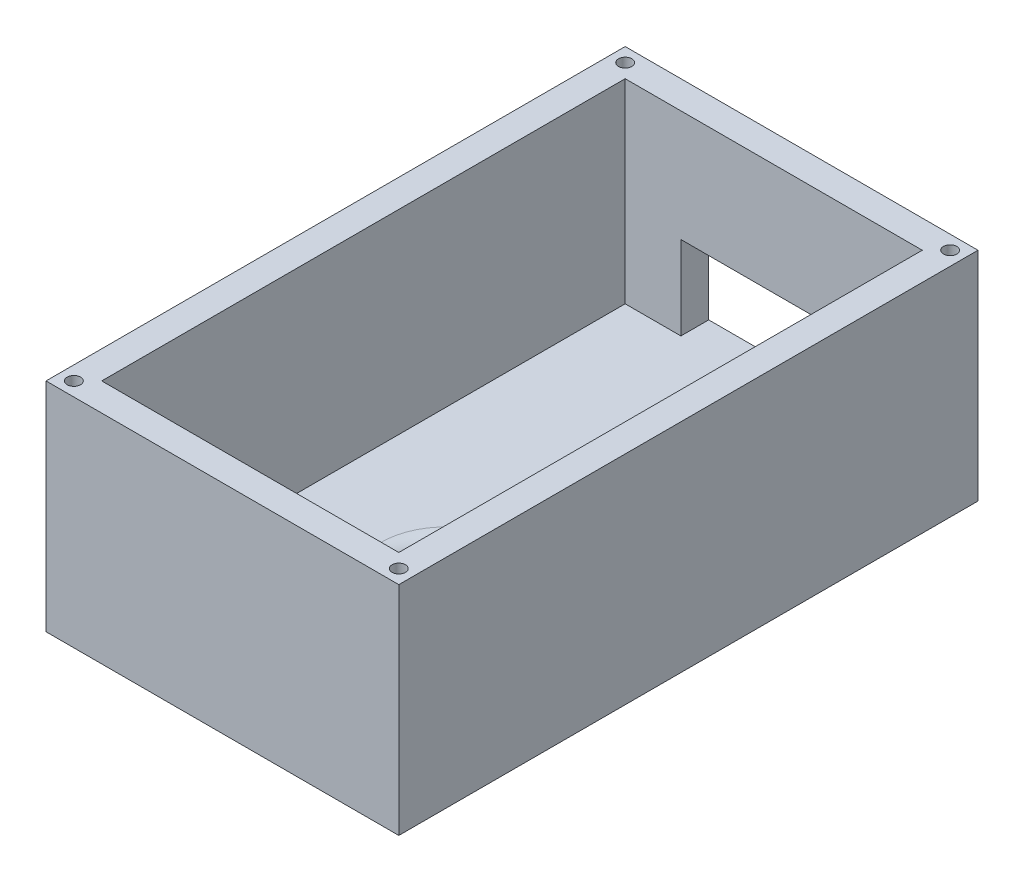
ISO-10303-21;
HEADER;
FILE_DESCRIPTION(('STEP AP214'),'2;1');
FILE_NAME('part.step','',(''),(''),'','','');
FILE_SCHEMA(('AUTOMOTIVE_DESIGN { 1 0 10303 214 1 1 1 1 }'));
ENDSEC;
DATA;
#1=APPLICATION_CONTEXT('core data for automotive mechanical design processes');
#2=APPLICATION_PROTOCOL_DEFINITION('international standard','automotive_design',2000,#1);
#3=PRODUCT_CONTEXT('',#1,'mechanical');
#4=PRODUCT('Part','Part','',(#3));
#5=PRODUCT_RELATED_PRODUCT_CATEGORY('part','',(#4));
#6=PRODUCT_DEFINITION_FORMATION('','',#4);
#7=PRODUCT_DEFINITION_CONTEXT('part definition',#1,'design');
#8=PRODUCT_DEFINITION('design','',#6,#7);
#9=PRODUCT_DEFINITION_SHAPE('','',#8);
#10=(LENGTH_UNIT() NAMED_UNIT(*) SI_UNIT(.MILLI.,.METRE.));
#11=(NAMED_UNIT(*) PLANE_ANGLE_UNIT() SI_UNIT($,.RADIAN.));
#12=(NAMED_UNIT(*) SI_UNIT($,.STERADIAN.) SOLID_ANGLE_UNIT());
#13=UNCERTAINTY_MEASURE_WITH_UNIT(LENGTH_MEASURE(1.E-05),#10,'distance_accuracy_value','');
#14=(GEOMETRIC_REPRESENTATION_CONTEXT(3) GLOBAL_UNCERTAINTY_ASSIGNED_CONTEXT((#13)) GLOBAL_UNIT_ASSIGNED_CONTEXT((#10,
#11,#12)) REPRESENTATION_CONTEXT('',''));
#15=CARTESIAN_POINT('',(0.,0.,0.));
#16=DIRECTION('',(0.,0.,1.));
#17=DIRECTION('',(1.,0.,0.));
#18=AXIS2_PLACEMENT_3D('',#15,#16,#17);
#19=CARTESIAN_POINT('',(2.49053892215568,4.,-3.42449101796407));
#20=DIRECTION('',(1.,0.,0.));
#21=DIRECTION('',(0.,0.,-1.));
#22=AXIS2_PLACEMENT_3D('',#19,#20,#21);
#23=PLANE('',#22);
#24=DIRECTION('',(0.,0.,1.));
#25=VECTOR('',#24,1.);
#26=CARTESIAN_POINT('',(2.49053892215568,0.,-3.42449101796407));
#27=LINE('',#26,#25);
#28=CARTESIAN_POINT('',(2.49053892215568,0.,-107.404491017964));
#29=VERTEX_POINT('',#28);
#30=CARTESIAN_POINT('',(2.49053892215568,0.,-3.42449101796407));
#31=VERTEX_POINT('',#30);
#32=EDGE_CURVE('E359',#29,#31,#27,.T.);
#33=ORIENTED_EDGE('',*,*,#32,.T.);
#34=DIRECTION('',(0.,-1.,0.));
#35=VECTOR('',#34,1.);
#36=CARTESIAN_POINT('',(2.49053892215568,4.,-3.42449101796407));
#37=LINE('',#36,#35);
#38=CARTESIAN_POINT('',(2.49053892215568,39.,-3.42449101796407));
#39=VERTEX_POINT('',#38);
#40=EDGE_CURVE('E384',#39,#31,#37,.T.);
#41=ORIENTED_EDGE('',*,*,#40,.F.);
#42=DIRECTION('',(0.,0.,1.));
#43=VECTOR('',#42,1.);
#44=CARTESIAN_POINT('',(2.49053892215568,39.,-107.404491017964));
#45=LINE('',#44,#43);
#46=CARTESIAN_POINT('',(2.49053892215568,39.,-107.404491017964));
#47=VERTEX_POINT('',#46);
#48=EDGE_CURVE('E343',#47,#39,#45,.T.);
#49=ORIENTED_EDGE('',*,*,#48,.F.);
#50=DIRECTION('',(0.,-1.,0.));
#51=VECTOR('',#50,1.);
#52=CARTESIAN_POINT('',(2.49053892215568,4.,-107.404491017964));
#53=LINE('',#52,#51);
#54=EDGE_CURVE('E372',#47,#29,#53,.T.);
#55=ORIENTED_EDGE('',*,*,#54,.T.);
#56=EDGE_LOOP('',(#33,#41,#49,#55));
#57=FACE_BOUND('',#56,.T.);
#58=ADVANCED_FACE('F38',(#57),#23,.F.);
#59=CARTESIAN_POINT('',(2.49053892215568,4.,-3.42449101796407));
#60=DIRECTION('',(0.,0.,-1.));
#61=DIRECTION('',(-1.,0.,0.));
#62=AXIS2_PLACEMENT_3D('',#59,#60,#61);
#63=PLANE('',#62);
#64=DIRECTION('',(1.,0.,0.));
#65=VECTOR('',#64,1.);
#66=CARTESIAN_POINT('',(2.49053892215568,0.,-3.42449101796407));
#67=LINE('',#66,#65);
#68=CARTESIAN_POINT('',(65.8305389221557,0.,-3.42449101796407));
#69=VERTEX_POINT('',#68);
#70=EDGE_CURVE('E363',#31,#69,#67,.T.);
#71=ORIENTED_EDGE('',*,*,#70,.T.);
#72=DIRECTION('',(0.,-1.,0.));
#73=VECTOR('',#72,1.);
#74=CARTESIAN_POINT('',(65.8305389221557,4.,-3.42449101796407));
#75=LINE('',#74,#73);
#76=CARTESIAN_POINT('',(65.8305389221557,39.,-3.42449101796407));
#77=VERTEX_POINT('',#76);
#78=EDGE_CURVE('E380',#77,#69,#75,.T.);
#79=ORIENTED_EDGE('',*,*,#78,.F.);
#80=DIRECTION('',(1.,0.,0.));
#81=VECTOR('',#80,1.);
#82=CARTESIAN_POINT('',(2.49053892215568,39.,-3.42449101796407));
#83=LINE('',#82,#81);
#84=EDGE_CURVE('E347',#39,#77,#83,.T.);
#85=ORIENTED_EDGE('',*,*,#84,.F.);
#86=ORIENTED_EDGE('',*,*,#40,.T.);
#87=EDGE_LOOP('',(#71,#79,#85,#86));
#88=FACE_BOUND('',#87,.T.);
#89=ADVANCED_FACE('F452',(#88),#63,.F.);
#90=CARTESIAN_POINT('',(65.8305389221557,4.,-3.42449101796407));
#91=DIRECTION('',(-1.,0.,0.));
#92=DIRECTION('',(0.,0.,1.));
#93=AXIS2_PLACEMENT_3D('',#90,#91,#92);
#94=PLANE('',#93);
#95=DIRECTION('',(0.,0.,-1.));
#96=VECTOR('',#95,1.);
#97=CARTESIAN_POINT('',(65.8305389221557,0.,-3.42449101796407));
#98=LINE('',#97,#96);
#99=CARTESIAN_POINT('',(65.8305389221557,0.,-107.404491017964));
#100=VERTEX_POINT('',#99);
#101=EDGE_CURVE('E366',#69,#100,#98,.T.);
#102=ORIENTED_EDGE('',*,*,#101,.T.);
#103=DIRECTION('',(0.,-1.,0.));
#104=VECTOR('',#103,1.);
#105=CARTESIAN_POINT('',(65.8305389221557,4.,-107.404491017964));
#106=LINE('',#105,#104);
#107=CARTESIAN_POINT('',(65.8305389221557,39.,-107.404491017964));
#108=VERTEX_POINT('',#107);
#109=EDGE_CURVE('E376',#108,#100,#106,.T.);
#110=ORIENTED_EDGE('',*,*,#109,.F.);
#111=DIRECTION('',(0.,0.,-1.));
#112=VECTOR('',#111,1.);
#113=CARTESIAN_POINT('',(65.8305389221557,39.,-107.404491017964));
#114=LINE('',#113,#112);
#115=EDGE_CURVE('E351',#77,#108,#114,.T.);
#116=ORIENTED_EDGE('',*,*,#115,.F.);
#117=ORIENTED_EDGE('',*,*,#78,.T.);
#118=EDGE_LOOP('',(#102,#110,#116,#117));
#119=FACE_BOUND('',#118,.T.);
#120=ADVANCED_FACE('F458',(#119),#94,.F.);
#121=CARTESIAN_POINT('',(2.49053892215568,4.,-107.404491017964));
#122=DIRECTION('',(0.,0.,1.));
#123=DIRECTION('',(1.,0.,0.));
#124=AXIS2_PLACEMENT_3D('',#121,#122,#123);
#125=PLANE('',#124);
#126=DIRECTION('',(-1.,0.,0.));
#127=VECTOR('',#126,1.);
#128=CARTESIAN_POINT('',(17.4905389221557,19.,-107.404491017964));
#129=LINE('',#128,#127);
#130=CARTESIAN_POINT('',(50.8305389221557,19.,-107.404491017964));
#131=VERTEX_POINT('',#130);
#132=CARTESIAN_POINT('',(17.4905389221557,19.,-107.404491017964));
#133=VERTEX_POINT('',#132);
#134=EDGE_CURVE('E242',#131,#133,#129,.T.);
#135=ORIENTED_EDGE('',*,*,#134,.T.);
#136=DIRECTION('',(0.,-1.,0.));
#137=VECTOR('',#136,1.);
#138=CARTESIAN_POINT('',(17.4905389221557,4.,-107.404491017964));
#139=LINE('',#138,#137);
#140=CARTESIAN_POINT('',(17.4905389221557,4.,-107.404491017964));
#141=VERTEX_POINT('',#140);
#142=EDGE_CURVE('E229',#133,#141,#139,.T.);
#143=ORIENTED_EDGE('',*,*,#142,.T.);
#144=DIRECTION('',(1.,0.,0.));
#145=VECTOR('',#144,1.);
#146=CARTESIAN_POINT('',(17.4905389221557,4.,-107.404491017964));
#147=LINE('',#146,#145);
#148=CARTESIAN_POINT('',(50.8305389221557,4.,-107.404491017964));
#149=VERTEX_POINT('',#148);
#150=EDGE_CURVE('E233',#141,#149,#147,.T.);
#151=ORIENTED_EDGE('',*,*,#150,.T.);
#152=DIRECTION('',(0.,1.,0.));
#153=VECTOR('',#152,1.);
#154=CARTESIAN_POINT('',(50.8305389221557,4.,-107.404491017964));
#155=LINE('',#154,#153);
#156=EDGE_CURVE('E238',#149,#131,#155,.T.);
#157=ORIENTED_EDGE('',*,*,#156,.T.);
#158=EDGE_LOOP('',(#135,#143,#151,#157));
#159=FACE_BOUND('',#158,.T.);
#160=DIRECTION('',(-1.,0.,0.));
#161=VECTOR('',#160,1.);
#162=CARTESIAN_POINT('',(2.49053892215568,0.,-107.404491017964));
#163=LINE('',#162,#161);
#164=EDGE_CURVE('E369',#100,#29,#163,.T.);
#165=ORIENTED_EDGE('',*,*,#164,.T.);
#166=ORIENTED_EDGE('',*,*,#54,.F.);
#167=DIRECTION('',(-1.,0.,0.));
#168=VECTOR('',#167,1.);
#169=CARTESIAN_POINT('',(2.49053892215568,39.,-107.404491017964));
#170=LINE('',#169,#168);
#171=EDGE_CURVE('E355',#108,#47,#170,.T.);
#172=ORIENTED_EDGE('',*,*,#171,.F.);
#173=ORIENTED_EDGE('',*,*,#109,.T.);
#174=EDGE_LOOP('',(#165,#166,#172,#173));
#175=FACE_BOUND('',#174,.T.);
#176=ADVANCED_FACE('F639',(#159,#175),#125,.F.);
#177=CARTESIAN_POINT('',(0.,0.,0.));
#178=DIRECTION('',(0.,-1.,0.));
#179=DIRECTION('',(0.,0.,-1.));
#180=AXIS2_PLACEMENT_3D('',#177,#178,#179);
#181=PLANE('',#180);
#182=CARTESIAN_POINT('',(26.1605389221557,0.,-33.8198046618148));
#183=DIRECTION('',(0.,1.,0.));
#184=DIRECTION('',(0.,0.,-1.));
#185=AXIS2_PLACEMENT_3D('',#182,#183,#184);
#186=CIRCLE('',#185,5.);
#187=CARTESIAN_POINT('',(31.1605389221557,0.,-33.8198046618148));
#188=VERTEX_POINT('',#187);
#189=CARTESIAN_POINT('',(29.3605389221557,0.,-37.6616792042745));
#190=VERTEX_POINT('',#189);
#191=EDGE_CURVE('E205',#188,#190,#186,.T.);
#192=ORIENTED_EDGE('',*,*,#191,.F.);
#193=DIRECTION('',(0.,0.,-1.));
#194=VECTOR('',#193,1.);
#195=CARTESIAN_POINT('',(31.1605389221557,0.,-33.8198046618148));
#196=LINE('',#195,#194);
#197=CARTESIAN_POINT('',(31.1605389221557,0.,-20.4244910179641));
#198=VERTEX_POINT('',#197);
#199=EDGE_CURVE('E224',#198,#188,#196,.T.);
#200=ORIENTED_EDGE('',*,*,#199,.F.);
#201=CARTESIAN_POINT('',(33.1605389221557,0.,-20.4244910179641));
#202=DIRECTION('',(0.,-1.,0.));
#203=DIRECTION('',(0.,0.,1.));
#204=AXIS2_PLACEMENT_3D('',#201,#202,#203);
#205=CIRCLE('',#204,2.);
#206=CARTESIAN_POINT('',(33.1605389221557,0.,-18.4244910179641));
#207=VERTEX_POINT('',#206);
#208=EDGE_CURVE('E220',#207,#198,#205,.T.);
#209=ORIENTED_EDGE('',*,*,#208,.F.);
#210=DIRECTION('',(-1.,0.,0.));
#211=VECTOR('',#210,1.);
#212=CARTESIAN_POINT('',(33.1605389221557,0.,-18.4244910179641));
#213=LINE('',#212,#211);
#214=CARTESIAN_POINT('',(35.1605389221557,0.,-18.4244910179641));
#215=VERTEX_POINT('',#214);
#216=EDGE_CURVE('E216',#215,#207,#213,.T.);
#217=ORIENTED_EDGE('',*,*,#216,.F.);
#218=CARTESIAN_POINT('',(35.1605389221557,0.,-20.4244910179641));
#219=DIRECTION('',(0.,-1.,0.));
#220=DIRECTION('',(0.,0.,-1.));
#221=AXIS2_PLACEMENT_3D('',#218,#219,#220);
#222=CIRCLE('',#221,2.);
#223=CARTESIAN_POINT('',(37.1605389221557,0.,-20.4244910179641));
#224=VERTEX_POINT('',#223);
#225=EDGE_CURVE('E212',#224,#215,#222,.T.);
#226=ORIENTED_EDGE('',*,*,#225,.F.);
#227=DIRECTION('',(0.,0.,1.));
#228=VECTOR('',#227,1.);
#229=CARTESIAN_POINT('',(37.1605389221557,0.,-33.8198046618148));
#230=LINE('',#229,#228);
#231=CARTESIAN_POINT('',(37.1605389221557,0.,-33.8198046618148));
#232=VERTEX_POINT('',#231);
#233=EDGE_CURVE('E184',#232,#224,#230,.T.);
#234=ORIENTED_EDGE('',*,*,#233,.F.);
#235=CARTESIAN_POINT('',(42.1605389221557,0.,-33.8198046618148));
#236=DIRECTION('',(0.,1.,0.));
#237=DIRECTION('',(0.,0.,1.));
#238=AXIS2_PLACEMENT_3D('',#235,#236,#237);
#239=CIRCLE('',#238,5.);
#240=CARTESIAN_POINT('',(38.9605389221557,0.,-37.6616792042745));
#241=VERTEX_POINT('',#240);
#242=EDGE_CURVE('E175',#241,#232,#239,.T.);
#243=ORIENTED_EDGE('',*,*,#242,.F.);
#244=CARTESIAN_POINT('',(34.1605389221557,0.,-43.4244910179641));
#245=DIRECTION('',(0.,-1.,0.));
#246=DIRECTION('',(0.,0.,-1.));
#247=AXIS2_PLACEMENT_3D('',#244,#245,#246);
#248=CIRCLE('',#247,7.5);
#249=EDGE_CURVE('E181',#190,#241,#248,.T.);
#250=ORIENTED_EDGE('',*,*,#249,.F.);
#251=EDGE_LOOP('',(#192,#200,#209,#217,#226,#234,#243,#250));
#252=FACE_BOUND('',#251,.T.);
#253=CARTESIAN_POINT('',(4.99053892215568,0.,-104.904491017964));
#254=DIRECTION('',(0.,1.,0.));
#255=DIRECTION('',(0.,0.,1.));
#256=AXIS2_PLACEMENT_3D('',#253,#254,#255);
#257=CIRCLE('',#256,1.19999999999999);
#258=CARTESIAN_POINT('',(4.99053892215568,0.,-103.704491017964));
#259=VERTEX_POINT('',#258);
#260=EDGE_CURVE('E272',#259,#259,#257,.T.);
#261=ORIENTED_EDGE('',*,*,#260,.T.);
#262=EDGE_LOOP('',(#261));
#263=FACE_BOUND('',#262,.T.);
#264=CARTESIAN_POINT('',(63.3305389221557,0.,-104.904491017964));
#265=DIRECTION('',(0.,1.,0.));
#266=DIRECTION('',(0.,0.,1.));
#267=AXIS2_PLACEMENT_3D('',#264,#265,#266);
#268=CIRCLE('',#267,1.19999999999999);
#269=CARTESIAN_POINT('',(63.3305389221557,0.,-103.704491017964));
#270=VERTEX_POINT('',#269);
#271=EDGE_CURVE('E280',#270,#270,#268,.T.);
#272=ORIENTED_EDGE('',*,*,#271,.T.);
#273=EDGE_LOOP('',(#272));
#274=FACE_BOUND('',#273,.T.);
#275=CARTESIAN_POINT('',(63.3305389221557,0.,-5.92449101796407));
#276=DIRECTION('',(0.,1.,0.));
#277=DIRECTION('',(0.,0.,1.));
#278=AXIS2_PLACEMENT_3D('',#275,#276,#277);
#279=CIRCLE('',#278,1.19999999999999);
#280=CARTESIAN_POINT('',(63.3305389221557,0.,-4.72449101796408));
#281=VERTEX_POINT('',#280);
#282=EDGE_CURVE('E288',#281,#281,#279,.T.);
#283=ORIENTED_EDGE('',*,*,#282,.T.);
#284=EDGE_LOOP('',(#283));
#285=FACE_BOUND('',#284,.T.);
#286=CARTESIAN_POINT('',(4.99053892215568,0.,-5.92449101796407));
#287=DIRECTION('',(0.,1.,0.));
#288=DIRECTION('',(0.,0.,1.));
#289=AXIS2_PLACEMENT_3D('',#286,#287,#288);
#290=CIRCLE('',#289,1.19999999999999);
#291=CARTESIAN_POINT('',(4.99053892215568,0.,-4.72449101796408));
#292=VERTEX_POINT('',#291);
#293=EDGE_CURVE('E296',#292,#292,#290,.T.);
#294=ORIENTED_EDGE('',*,*,#293,.T.);
#295=EDGE_LOOP('',(#294));
#296=FACE_BOUND('',#295,.T.);
#297=ORIENTED_EDGE('',*,*,#32,.F.);
#298=ORIENTED_EDGE('',*,*,#164,.F.);
#299=ORIENTED_EDGE('',*,*,#101,.F.);
#300=ORIENTED_EDGE('',*,*,#70,.F.);
#301=EDGE_LOOP('',(#297,#298,#299,#300));
#302=FACE_BOUND('',#301,.T.);
#303=ADVANCED_FACE('F178',(#252,#263,#274,#285,#296,#302),#181,.T.);
#304=CARTESIAN_POINT('',(0.,39.,0.));
#305=DIRECTION('',(0.,1.,0.));
#306=DIRECTION('',(0.,0.,1.));
#307=AXIS2_PLACEMENT_3D('',#304,#305,#306);
#308=PLANE('',#307);
#309=CARTESIAN_POINT('',(4.99053892215568,39.,-104.904491017964));
#310=DIRECTION('',(0.,1.,0.));
#311=DIRECTION('',(0.,0.,1.));
#312=AXIS2_PLACEMENT_3D('',#309,#310,#311);
#313=CIRCLE('',#312,1.19999999999999);
#314=CARTESIAN_POINT('',(4.99053892215568,39.,-103.704491017964));
#315=VERTEX_POINT('',#314);
#316=EDGE_CURVE('E259',#315,#315,#313,.T.);
#317=ORIENTED_EDGE('',*,*,#316,.F.);
#318=EDGE_LOOP('',(#317));
#319=FACE_BOUND('',#318,.T.);
#320=CARTESIAN_POINT('',(63.3305389221557,39.,-104.904491017964));
#321=DIRECTION('',(0.,1.,0.));
#322=DIRECTION('',(0.,0.,1.));
#323=AXIS2_PLACEMENT_3D('',#320,#321,#322);
#324=CIRCLE('',#323,1.19999999999999);
#325=CARTESIAN_POINT('',(63.3305389221557,39.,-103.704491017964));
#326=VERTEX_POINT('',#325);
#327=EDGE_CURVE('E276',#326,#326,#324,.T.);
#328=ORIENTED_EDGE('',*,*,#327,.F.);
#329=EDGE_LOOP('',(#328));
#330=FACE_BOUND('',#329,.T.);
#331=CARTESIAN_POINT('',(63.3305389221557,39.,-5.92449101796407));
#332=DIRECTION('',(0.,1.,0.));
#333=DIRECTION('',(0.,0.,1.));
#334=AXIS2_PLACEMENT_3D('',#331,#332,#333);
#335=CIRCLE('',#334,1.19999999999999);
#336=CARTESIAN_POINT('',(63.3305389221557,39.,-4.72449101796408));
#337=VERTEX_POINT('',#336);
#338=EDGE_CURVE('E284',#337,#337,#335,.T.);
#339=ORIENTED_EDGE('',*,*,#338,.F.);
#340=EDGE_LOOP('',(#339));
#341=FACE_BOUND('',#340,.T.);
#342=CARTESIAN_POINT('',(4.99053892215568,39.,-5.92449101796407));
#343=DIRECTION('',(0.,1.,0.));
#344=DIRECTION('',(0.,0.,1.));
#345=AXIS2_PLACEMENT_3D('',#342,#343,#344);
#346=CIRCLE('',#345,1.19999999999999);
#347=CARTESIAN_POINT('',(4.99053892215568,39.,-4.72449101796408));
#348=VERTEX_POINT('',#347);
#349=EDGE_CURVE('E292',#348,#348,#346,.T.);
#350=ORIENTED_EDGE('',*,*,#349,.F.);
#351=EDGE_LOOP('',(#350));
#352=FACE_BOUND('',#351,.T.);
#353=ORIENTED_EDGE('',*,*,#48,.T.);
#354=ORIENTED_EDGE('',*,*,#84,.T.);
#355=ORIENTED_EDGE('',*,*,#115,.T.);
#356=ORIENTED_EDGE('',*,*,#171,.T.);
#357=EDGE_LOOP('',(#353,#354,#355,#356));
#358=FACE_BOUND('',#357,.T.);
#359=DIRECTION('',(0.,0.,1.));
#360=VECTOR('',#359,1.);
#361=CARTESIAN_POINT('',(7.49053892215568,39.,-102.404491017964));
#362=LINE('',#361,#360);
#363=CARTESIAN_POINT('',(7.49053892215568,39.,-102.404491017964));
#364=VERTEX_POINT('',#363);
#365=CARTESIAN_POINT('',(7.49053892215568,39.,-8.42449101796407));
#366=VERTEX_POINT('',#365);
#367=EDGE_CURVE('E304',#364,#366,#362,.T.);
#368=ORIENTED_EDGE('',*,*,#367,.F.);
#369=DIRECTION('',(-1.,0.,0.));
#370=VECTOR('',#369,1.);
#371=CARTESIAN_POINT('',(7.49053892215568,39.,-102.404491017964));
#372=LINE('',#371,#370);
#373=CARTESIAN_POINT('',(60.8305389221557,39.,-102.404491017964));
#374=VERTEX_POINT('',#373);
#375=EDGE_CURVE('E301',#374,#364,#372,.T.);
#376=ORIENTED_EDGE('',*,*,#375,.F.);
#377=DIRECTION('',(0.,0.,-1.));
#378=VECTOR('',#377,1.);
#379=CARTESIAN_POINT('',(60.8305389221557,39.,-102.404491017964));
#380=LINE('',#379,#378);
#381=CARTESIAN_POINT('',(60.8305389221557,39.,-8.42449101796407));
#382=VERTEX_POINT('',#381);
#383=EDGE_CURVE('E312',#382,#374,#380,.T.);
#384=ORIENTED_EDGE('',*,*,#383,.F.);
#385=DIRECTION('',(1.,0.,0.));
#386=VECTOR('',#385,1.);
#387=CARTESIAN_POINT('',(7.49053892215568,39.,-8.42449101796407));
#388=LINE('',#387,#386);
#389=EDGE_CURVE('E308',#366,#382,#388,.T.);
#390=ORIENTED_EDGE('',*,*,#389,.F.);
#391=EDGE_LOOP('',(#368,#376,#384,#390));
#392=FACE_BOUND('',#391,.T.);
#393=ADVANCED_FACE('F628',(#319,#330,#341,#352,#358,#392),#308,.T.);
#394=CARTESIAN_POINT('',(7.49053892215568,39.,-102.404491017964));
#395=DIRECTION('',(0.,0.,1.));
#396=DIRECTION('',(1.,0.,0.));
#397=AXIS2_PLACEMENT_3D('',#394,#395,#396);
#398=PLANE('',#397);
#399=DIRECTION('',(0.,-1.,0.));
#400=VECTOR('',#399,1.);
#401=CARTESIAN_POINT('',(17.4905389221557,4.,-102.404491017964));
#402=LINE('',#401,#400);
#403=CARTESIAN_POINT('',(17.4905389221557,19.,-102.404491017964));
#404=VERTEX_POINT('',#403);
#405=CARTESIAN_POINT('',(17.4905389221557,4.,-102.404491017964));
#406=VERTEX_POINT('',#405);
#407=EDGE_CURVE('E228',#404,#406,#402,.T.);
#408=ORIENTED_EDGE('',*,*,#407,.F.);
#409=DIRECTION('',(-1.,0.,0.));
#410=VECTOR('',#409,1.);
#411=CARTESIAN_POINT('',(17.4905389221557,19.,-102.404491017964));
#412=LINE('',#411,#410);
#413=CARTESIAN_POINT('',(50.8305389221557,19.,-102.404491017964));
#414=VERTEX_POINT('',#413);
#415=EDGE_CURVE('E234',#414,#404,#412,.T.);
#416=ORIENTED_EDGE('',*,*,#415,.F.);
#417=DIRECTION('',(0.,1.,0.));
#418=VECTOR('',#417,1.);
#419=CARTESIAN_POINT('',(50.8305389221557,4.,-102.404491017964));
#420=LINE('',#419,#418);
#421=CARTESIAN_POINT('',(50.8305389221557,4.,-102.404491017964));
#422=VERTEX_POINT('',#421);
#423=EDGE_CURVE('E249',#422,#414,#420,.T.);
#424=ORIENTED_EDGE('',*,*,#423,.F.);
#425=DIRECTION('',(-1.,0.,0.));
#426=VECTOR('',#425,1.);
#427=CARTESIAN_POINT('',(7.49053892215568,4.,-102.404491017964));
#428=LINE('',#427,#426);
#429=CARTESIAN_POINT('',(60.8305389221557,4.,-102.404491017964));
#430=VERTEX_POINT('',#429);
#431=EDGE_CURVE('E316',#430,#422,#428,.T.);
#432=ORIENTED_EDGE('',*,*,#431,.F.);
#433=DIRECTION('',(0.,-1.,0.));
#434=VECTOR('',#433,1.);
#435=CARTESIAN_POINT('',(60.8305389221557,39.,-102.404491017964));
#436=LINE('',#435,#434);
#437=EDGE_CURVE('E315',#374,#430,#436,.T.);
#438=ORIENTED_EDGE('',*,*,#437,.F.);
#439=ORIENTED_EDGE('',*,*,#375,.T.);
#440=DIRECTION('',(0.,-1.,0.));
#441=VECTOR('',#440,1.);
#442=CARTESIAN_POINT('',(7.49053892215568,39.,-102.404491017964));
#443=LINE('',#442,#441);
#444=CARTESIAN_POINT('',(7.49053892215568,4.,-102.404491017964));
#445=VERTEX_POINT('',#444);
#446=EDGE_CURVE('E339',#364,#445,#443,.T.);
#447=ORIENTED_EDGE('',*,*,#446,.T.);
#448=EDGE_CURVE('E300',#406,#445,#428,.T.);
#449=ORIENTED_EDGE('',*,*,#448,.F.);
#450=EDGE_LOOP('',(#408,#416,#424,#432,#438,#439,#447,#449));
#451=FACE_BOUND('',#450,.T.);
#452=ADVANCED_FACE('F619',(#451),#398,.T.);
#453=CARTESIAN_POINT('',(7.49053892215568,39.,-102.404491017964));
#454=DIRECTION('',(1.,0.,0.));
#455=DIRECTION('',(0.,0.,-1.));
#456=AXIS2_PLACEMENT_3D('',#453,#454,#455);
#457=PLANE('',#456);
#458=DIRECTION('',(0.,0.,1.));
#459=VECTOR('',#458,1.);
#460=CARTESIAN_POINT('',(7.49053892215568,4.,-102.404491017964));
#461=LINE('',#460,#459);
#462=CARTESIAN_POINT('',(7.49053892215568,4.,-8.42449101796407));
#463=VERTEX_POINT('',#462);
#464=EDGE_CURVE('E320',#445,#463,#461,.T.);
#465=ORIENTED_EDGE('',*,*,#464,.F.);
#466=ORIENTED_EDGE('',*,*,#446,.F.);
#467=ORIENTED_EDGE('',*,*,#367,.T.);
#468=DIRECTION('',(0.,-1.,0.));
#469=VECTOR('',#468,1.);
#470=CARTESIAN_POINT('',(7.49053892215568,39.,-8.42449101796407));
#471=LINE('',#470,#469);
#472=EDGE_CURVE('E336',#366,#463,#471,.T.);
#473=ORIENTED_EDGE('',*,*,#472,.T.);
#474=EDGE_LOOP('',(#465,#466,#467,#473));
#475=FACE_BOUND('',#474,.T.);
#476=ADVANCED_FACE('F610',(#475),#457,.T.);
#477=CARTESIAN_POINT('',(7.49053892215568,39.,-8.42449101796407));
#478=DIRECTION('',(0.,0.,-1.));
#479=DIRECTION('',(-1.,0.,0.));
#480=AXIS2_PLACEMENT_3D('',#477,#478,#479);
#481=PLANE('',#480);
#482=DIRECTION('',(1.,0.,0.));
#483=VECTOR('',#482,1.);
#484=CARTESIAN_POINT('',(7.49053892215568,4.,-8.42449101796407));
#485=LINE('',#484,#483);
#486=CARTESIAN_POINT('',(60.8305389221557,4.,-8.42449101796407));
#487=VERTEX_POINT('',#486);
#488=EDGE_CURVE('E324',#463,#487,#485,.T.);
#489=ORIENTED_EDGE('',*,*,#488,.F.);
#490=ORIENTED_EDGE('',*,*,#472,.F.);
#491=ORIENTED_EDGE('',*,*,#389,.T.);
#492=DIRECTION('',(0.,-1.,0.));
#493=VECTOR('',#492,1.);
#494=CARTESIAN_POINT('',(60.8305389221557,39.,-8.42449101796407));
#495=LINE('',#494,#493);
#496=EDGE_CURVE('E333',#382,#487,#495,.T.);
#497=ORIENTED_EDGE('',*,*,#496,.T.);
#498=EDGE_LOOP('',(#489,#490,#491,#497));
#499=FACE_BOUND('',#498,.T.);
#500=ADVANCED_FACE('F601',(#499),#481,.T.);
#501=CARTESIAN_POINT('',(60.8305389221557,39.,-102.404491017964));
#502=DIRECTION('',(-1.,0.,0.));
#503=DIRECTION('',(0.,0.,1.));
#504=AXIS2_PLACEMENT_3D('',#501,#502,#503);
#505=PLANE('',#504);
#506=DIRECTION('',(0.,0.,-1.));
#507=VECTOR('',#506,1.);
#508=CARTESIAN_POINT('',(60.8305389221557,4.,-102.404491017964));
#509=LINE('',#508,#507);
#510=EDGE_CURVE('E305',#487,#430,#509,.T.);
#511=ORIENTED_EDGE('',*,*,#510,.F.);
#512=ORIENTED_EDGE('',*,*,#496,.F.);
#513=ORIENTED_EDGE('',*,*,#383,.T.);
#514=ORIENTED_EDGE('',*,*,#437,.T.);
#515=EDGE_LOOP('',(#511,#512,#513,#514));
#516=FACE_BOUND('',#515,.T.);
#517=ADVANCED_FACE('F553',(#516),#505,.T.);
#518=CARTESIAN_POINT('',(0.,4.,0.));
#519=DIRECTION('',(0.,-1.,0.));
#520=DIRECTION('',(0.,0.,-1.));
#521=AXIS2_PLACEMENT_3D('',#518,#519,#520);
#522=PLANE('',#521);
#523=DIRECTION('',(0.,0.,-1.));
#524=VECTOR('',#523,1.);
#525=CARTESIAN_POINT('',(27.1605389221557,4.,0.));
#526=LINE('',#525,#524);
#527=CARTESIAN_POINT('',(27.1605389221557,4.,-20.4244910179641));
#528=VERTEX_POINT('',#527);
#529=CARTESIAN_POINT('',(27.1605389221557,4.,-33.8198046618148));
#530=VERTEX_POINT('',#529);
#531=EDGE_CURVE('E48',#528,#530,#526,.T.);
#532=ORIENTED_EDGE('',*,*,#531,.T.);
#533=CARTESIAN_POINT('',(26.1605389221557,4.,-33.8198046618148));
#534=DIRECTION('',(0.,-1.,0.));
#535=DIRECTION('',(0.,0.,-1.));
#536=AXIS2_PLACEMENT_3D('',#533,#534,#535);
#537=CIRCLE('',#536,1.);
#538=CARTESIAN_POINT('',(26.8005389221557,4.,-34.5881795703067));
#539=VERTEX_POINT('',#538);
#540=EDGE_CURVE('E11',#530,#539,#537,.F.);
#541=ORIENTED_EDGE('',*,*,#540,.T.);
#542=CARTESIAN_POINT('',(34.1605389221557,4.,-43.4244910179641));
#543=DIRECTION('',(0.,-1.,0.));
#544=DIRECTION('',(0.,0.,-1.));
#545=AXIS2_PLACEMENT_3D('',#542,#543,#544);
#546=CIRCLE('',#545,11.5);
#547=CARTESIAN_POINT('',(41.5205389221557,4.,-34.5881795703067));
#548=VERTEX_POINT('',#547);
#549=EDGE_CURVE('E388',#539,#548,#546,.T.);
#550=ORIENTED_EDGE('',*,*,#549,.T.);
#551=CARTESIAN_POINT('',(42.1605389221557,4.,-33.8198046618148));
#552=DIRECTION('',(0.,-1.,0.));
#553=DIRECTION('',(0.,0.,-1.));
#554=AXIS2_PLACEMENT_3D('',#551,#552,#553);
#555=CIRCLE('',#554,1.);
#556=CARTESIAN_POINT('',(41.1605389221557,4.,-33.8198046618148));
#557=VERTEX_POINT('',#556);
#558=EDGE_CURVE('E194',#548,#557,#555,.F.);
#559=ORIENTED_EDGE('',*,*,#558,.T.);
#560=DIRECTION('',(0.,0.,1.));
#561=VECTOR('',#560,1.);
#562=CARTESIAN_POINT('',(41.1605389221557,4.,0.));
#563=LINE('',#562,#561);
#564=CARTESIAN_POINT('',(41.1605389221557,4.,-20.4244910179641));
#565=VERTEX_POINT('',#564);
#566=EDGE_CURVE('E393',#557,#565,#563,.T.);
#567=ORIENTED_EDGE('',*,*,#566,.T.);
#568=CARTESIAN_POINT('',(35.1605389221557,4.,-20.4244910179641));
#569=DIRECTION('',(0.,-1.,0.));
#570=DIRECTION('',(0.,0.,-1.));
#571=AXIS2_PLACEMENT_3D('',#568,#569,#570);
#572=CIRCLE('',#571,6.);
#573=CARTESIAN_POINT('',(35.1605389221557,4.,-14.4244910179641));
#574=VERTEX_POINT('',#573);
#575=EDGE_CURVE('E396',#565,#574,#572,.T.);
#576=ORIENTED_EDGE('',*,*,#575,.T.);
#577=DIRECTION('',(-1.,0.,0.));
#578=VECTOR('',#577,1.);
#579=CARTESIAN_POINT('',(0.,4.,-14.4244910179641));
#580=LINE('',#579,#578);
#581=CARTESIAN_POINT('',(33.1605389221557,4.,-14.4244910179641));
#582=VERTEX_POINT('',#581);
#583=EDGE_CURVE('E399',#574,#582,#580,.T.);
#584=ORIENTED_EDGE('',*,*,#583,.T.);
#585=CARTESIAN_POINT('',(33.1605389221557,4.,-20.4244910179641));
#586=DIRECTION('',(0.,-1.,0.));
#587=DIRECTION('',(0.,0.,-1.));
#588=AXIS2_PLACEMENT_3D('',#585,#586,#587);
#589=CIRCLE('',#588,6.);
#590=EDGE_CURVE('E59',#582,#528,#589,.T.);
#591=ORIENTED_EDGE('',*,*,#590,.T.);
#592=EDGE_LOOP('',(#532,#541,#550,#559,#567,#576,#584,#591));
#593=FACE_BOUND('',#592,.T.);
#594=ORIENTED_EDGE('',*,*,#510,.T.);
#595=ORIENTED_EDGE('',*,*,#431,.T.);
#596=DIRECTION('',(0.,0.,1.));
#597=VECTOR('',#596,1.);
#598=CARTESIAN_POINT('',(50.8305389221557,4.,-107.404491017964));
#599=LINE('',#598,#597);
#600=EDGE_CURVE('E263',#149,#422,#599,.T.);
#601=ORIENTED_EDGE('',*,*,#600,.F.);
#602=ORIENTED_EDGE('',*,*,#150,.F.);
#603=DIRECTION('',(0.,0.,1.));
#604=VECTOR('',#603,1.);
#605=CARTESIAN_POINT('',(17.4905389221557,4.,-107.404491017964));
#606=LINE('',#605,#604);
#607=EDGE_CURVE('E246',#141,#406,#606,.T.);
#608=ORIENTED_EDGE('',*,*,#607,.T.);
#609=ORIENTED_EDGE('',*,*,#448,.T.);
#610=ORIENTED_EDGE('',*,*,#464,.T.);
#611=ORIENTED_EDGE('',*,*,#488,.T.);
#612=EDGE_LOOP('',(#594,#595,#601,#602,#608,#609,#610,#611));
#613=FACE_BOUND('',#612,.T.);
#614=ADVANCED_FACE('F441',(#593,#613),#522,.F.);
#615=CARTESIAN_POINT('',(4.99053892215568,39.,-5.92449101796407));
#616=DIRECTION('',(0.,1.,0.));
#617=DIRECTION('',(0.,0.,1.));
#618=AXIS2_PLACEMENT_3D('',#615,#616,#617);
#619=CYLINDRICAL_SURFACE('',#618,1.19999999999999);
#620=ORIENTED_EDGE('',*,*,#293,.F.);
#621=EDGE_LOOP('',(#620));
#622=FACE_BOUND('',#621,.T.);
#623=ORIENTED_EDGE('',*,*,#349,.T.);
#624=EDGE_LOOP('',(#623));
#625=FACE_BOUND('',#624,.T.);
#626=ADVANCED_FACE('F552',(#622,#625),#619,.F.);
#627=CARTESIAN_POINT('',(63.3305389221557,39.,-5.92449101796407));
#628=DIRECTION('',(0.,1.,0.));
#629=DIRECTION('',(0.,0.,1.));
#630=AXIS2_PLACEMENT_3D('',#627,#628,#629);
#631=CYLINDRICAL_SURFACE('',#630,1.19999999999999);
#632=ORIENTED_EDGE('',*,*,#282,.F.);
#633=EDGE_LOOP('',(#632));
#634=FACE_BOUND('',#633,.T.);
#635=ORIENTED_EDGE('',*,*,#338,.T.);
#636=EDGE_LOOP('',(#635));
#637=FACE_BOUND('',#636,.T.);
#638=ADVANCED_FACE('F575',(#634,#637),#631,.F.);
#639=CARTESIAN_POINT('',(63.3305389221557,39.,-104.904491017964));
#640=DIRECTION('',(0.,1.,0.));
#641=DIRECTION('',(0.,0.,1.));
#642=AXIS2_PLACEMENT_3D('',#639,#640,#641);
#643=CYLINDRICAL_SURFACE('',#642,1.19999999999999);
#644=ORIENTED_EDGE('',*,*,#271,.F.);
#645=EDGE_LOOP('',(#644));
#646=FACE_BOUND('',#645,.T.);
#647=ORIENTED_EDGE('',*,*,#327,.T.);
#648=EDGE_LOOP('',(#647));
#649=FACE_BOUND('',#648,.T.);
#650=ADVANCED_FACE('F565',(#646,#649),#643,.F.);
#651=CARTESIAN_POINT('',(4.99053892215568,39.,-104.904491017964));
#652=DIRECTION('',(0.,1.,0.));
#653=DIRECTION('',(0.,0.,1.));
#654=AXIS2_PLACEMENT_3D('',#651,#652,#653);
#655=CYLINDRICAL_SURFACE('',#654,1.19999999999999);
#656=ORIENTED_EDGE('',*,*,#260,.F.);
#657=EDGE_LOOP('',(#656));
#658=FACE_BOUND('',#657,.T.);
#659=ORIENTED_EDGE('',*,*,#316,.T.);
#660=EDGE_LOOP('',(#659));
#661=FACE_BOUND('',#660,.T.);
#662=ADVANCED_FACE('F542',(#658,#661),#655,.F.);
#663=CARTESIAN_POINT('',(17.4905389221557,4.,-107.404491017964));
#664=DIRECTION('',(-1.,0.,0.));
#665=DIRECTION('',(0.,0.,1.));
#666=AXIS2_PLACEMENT_3D('',#663,#664,#665);
#667=PLANE('',#666);
#668=ORIENTED_EDGE('',*,*,#407,.T.);
#669=ORIENTED_EDGE('',*,*,#607,.F.);
#670=ORIENTED_EDGE('',*,*,#142,.F.);
#671=DIRECTION('',(0.,0.,1.));
#672=VECTOR('',#671,1.);
#673=CARTESIAN_POINT('',(17.4905389221557,19.,-107.404491017964));
#674=LINE('',#673,#672);
#675=EDGE_CURVE('E256',#133,#404,#674,.T.);
#676=ORIENTED_EDGE('',*,*,#675,.T.);
#677=EDGE_LOOP('',(#668,#669,#670,#676));
#678=FACE_BOUND('',#677,.T.);
#679=ADVANCED_FACE('F533',(#678),#667,.F.);
#680=CARTESIAN_POINT('',(17.4905389221557,19.,-107.404491017964));
#681=DIRECTION('',(0.,1.,0.));
#682=DIRECTION('',(0.,0.,1.));
#683=AXIS2_PLACEMENT_3D('',#680,#681,#682);
#684=PLANE('',#683);
#685=ORIENTED_EDGE('',*,*,#415,.T.);
#686=ORIENTED_EDGE('',*,*,#675,.F.);
#687=ORIENTED_EDGE('',*,*,#134,.F.);
#688=DIRECTION('',(0.,0.,1.));
#689=VECTOR('',#688,1.);
#690=CARTESIAN_POINT('',(50.8305389221557,19.,-107.404491017964));
#691=LINE('',#690,#689);
#692=EDGE_CURVE('E260',#131,#414,#691,.T.);
#693=ORIENTED_EDGE('',*,*,#692,.T.);
#694=EDGE_LOOP('',(#685,#686,#687,#693));
#695=FACE_BOUND('',#694,.T.);
#696=ADVANCED_FACE('F523',(#695),#684,.F.);
#697=CARTESIAN_POINT('',(50.8305389221557,4.,-107.404491017964));
#698=DIRECTION('',(1.,0.,0.));
#699=DIRECTION('',(0.,0.,-1.));
#700=AXIS2_PLACEMENT_3D('',#697,#698,#699);
#701=PLANE('',#700);
#702=ORIENTED_EDGE('',*,*,#423,.T.);
#703=ORIENTED_EDGE('',*,*,#692,.F.);
#704=ORIENTED_EDGE('',*,*,#156,.F.);
#705=ORIENTED_EDGE('',*,*,#600,.T.);
#706=EDGE_LOOP('',(#702,#703,#704,#705));
#707=FACE_BOUND('',#706,.T.);
#708=ADVANCED_FACE('F515',(#707),#701,.F.);
#709=CARTESIAN_POINT('',(35.1605389221557,0.,-20.4244910179641));
#710=DIRECTION('',(0.,-1.,0.));
#711=DIRECTION('',(0.,0.,-1.));
#712=AXIS2_PLACEMENT_3D('',#709,#710,#711);
#713=TOROIDAL_SURFACE('',#712,6.,4.);
#714=CARTESIAN_POINT('',(41.1605389221557,0.,-20.4244910179641));
#715=DIRECTION('',(0.,0.,-1.));
#716=DIRECTION('',(-1.,0.,0.));
#717=AXIS2_PLACEMENT_3D('',#714,#715,#716);
#718=CIRCLE('',#717,4.);
#719=EDGE_CURVE('E419',#224,#565,#718,.T.);
#720=ORIENTED_EDGE('',*,*,#719,.F.);
#721=ORIENTED_EDGE('',*,*,#225,.T.);
#722=CARTESIAN_POINT('',(35.1605389221557,0.,-14.4244910179641));
#723=DIRECTION('',(-1.,0.,0.));
#724=DIRECTION('',(0.,0.,1.));
#725=AXIS2_PLACEMENT_3D('',#722,#723,#724);
#726=CIRCLE('',#725,4.);
#727=EDGE_CURVE('E42',#574,#215,#726,.T.);
#728=ORIENTED_EDGE('',*,*,#727,.F.);
#729=ORIENTED_EDGE('',*,*,#575,.F.);
#730=EDGE_LOOP('',(#720,#721,#728,#729));
#731=FACE_BOUND('',#730,.T.);
#732=ADVANCED_FACE('F40',(#731),#713,.T.);
#733=CARTESIAN_POINT('',(0.,0.,-14.4244910179641));
#734=DIRECTION('',(-1.,0.,0.));
#735=DIRECTION('',(0.,0.,1.));
#736=AXIS2_PLACEMENT_3D('',#733,#734,#735);
#737=CYLINDRICAL_SURFACE('',#736,4.);
#738=ORIENTED_EDGE('',*,*,#727,.T.);
#739=ORIENTED_EDGE('',*,*,#216,.T.);
#740=CARTESIAN_POINT('',(33.1605389221557,0.,-14.4244910179641));
#741=DIRECTION('',(-1.,0.,0.));
#742=DIRECTION('',(0.,0.,1.));
#743=AXIS2_PLACEMENT_3D('',#740,#741,#742);
#744=CIRCLE('',#743,4.);
#745=EDGE_CURVE('E416',#582,#207,#744,.T.);
#746=ORIENTED_EDGE('',*,*,#745,.F.);
#747=ORIENTED_EDGE('',*,*,#583,.F.);
#748=EDGE_LOOP('',(#738,#739,#746,#747));
#749=FACE_BOUND('',#748,.T.);
#750=ADVANCED_FACE('F430',(#749),#737,.T.);
#751=CARTESIAN_POINT('',(41.1605389221557,0.,0.));
#752=DIRECTION('',(0.,0.,1.));
#753=DIRECTION('',(1.,0.,0.));
#754=AXIS2_PLACEMENT_3D('',#751,#752,#753);
#755=CYLINDRICAL_SURFACE('',#754,4.);
#756=ORIENTED_EDGE('',*,*,#719,.T.);
#757=ORIENTED_EDGE('',*,*,#566,.F.);
#758=CARTESIAN_POINT('',(41.1605389221557,0.,-33.8198046618148));
#759=DIRECTION('',(0.,0.,-1.));
#760=DIRECTION('',(-1.,0.,0.));
#761=AXIS2_PLACEMENT_3D('',#758,#759,#760);
#762=CIRCLE('',#761,4.);
#763=EDGE_CURVE('E413',#232,#557,#762,.T.);
#764=ORIENTED_EDGE('',*,*,#763,.F.);
#765=ORIENTED_EDGE('',*,*,#233,.T.);
#766=EDGE_LOOP('',(#756,#757,#764,#765));
#767=FACE_BOUND('',#766,.T.);
#768=ADVANCED_FACE('F443',(#767),#755,.T.);
#769=CARTESIAN_POINT('',(33.1605389221557,0.,-20.4244910179641));
#770=DIRECTION('',(0.,-1.,0.));
#771=DIRECTION('',(0.,0.,-1.));
#772=AXIS2_PLACEMENT_3D('',#769,#770,#771);
#773=TOROIDAL_SURFACE('',#772,6.,4.);
#774=ORIENTED_EDGE('',*,*,#745,.T.);
#775=ORIENTED_EDGE('',*,*,#208,.T.);
#776=CARTESIAN_POINT('',(27.1605389221557,0.,-20.4244910179641));
#777=DIRECTION('',(0.,0.,-1.));
#778=DIRECTION('',(-1.,0.,0.));
#779=AXIS2_PLACEMENT_3D('',#776,#777,#778);
#780=CIRCLE('',#779,4.);
#781=EDGE_CURVE('E198',#528,#198,#780,.T.);
#782=ORIENTED_EDGE('',*,*,#781,.F.);
#783=ORIENTED_EDGE('',*,*,#590,.F.);
#784=EDGE_LOOP('',(#774,#775,#782,#783));
#785=FACE_BOUND('',#784,.T.);
#786=ADVANCED_FACE('F435',(#785),#773,.T.);
#787=CARTESIAN_POINT('',(42.1605389221557,0.,-33.8198046618148));
#788=DIRECTION('',(0.,-1.,0.));
#789=DIRECTION('',(0.,0.,-1.));
#790=AXIS2_PLACEMENT_3D('',#787,#788,#789);
#791=DEGENERATE_TOROIDAL_SURFACE('',#790,1.,4.,.T.);
#792=ORIENTED_EDGE('',*,*,#763,.T.);
#793=ORIENTED_EDGE('',*,*,#558,.F.);
#794=CARTESIAN_POINT('',(41.5205389221557,0.,-34.5881795703067));
#795=DIRECTION('',(0.768374908491942,0.,-0.64));
#796=DIRECTION('',(-0.64,0.,-0.768374908491942));
#797=AXIS2_PLACEMENT_3D('',#794,#795,#796);
#798=CIRCLE('',#797,4.);
#799=EDGE_CURVE('E192',#241,#548,#798,.T.);
#800=ORIENTED_EDGE('',*,*,#799,.F.);
#801=ORIENTED_EDGE('',*,*,#242,.T.);
#802=EDGE_LOOP('',(#792,#793,#800,#801));
#803=FACE_BOUND('',#802,.T.);
#804=ADVANCED_FACE('F193',(#803),#791,.T.);
#805=CARTESIAN_POINT('',(27.1605389221557,0.,0.));
#806=DIRECTION('',(0.,0.,-1.));
#807=DIRECTION('',(-1.,0.,0.));
#808=AXIS2_PLACEMENT_3D('',#805,#806,#807);
#809=CYLINDRICAL_SURFACE('',#808,4.);
#810=ORIENTED_EDGE('',*,*,#781,.T.);
#811=ORIENTED_EDGE('',*,*,#199,.T.);
#812=CARTESIAN_POINT('',(27.1605389221557,0.,-33.8198046618148));
#813=DIRECTION('',(0.,0.,-1.));
#814=DIRECTION('',(-1.,0.,0.));
#815=AXIS2_PLACEMENT_3D('',#812,#813,#814);
#816=CIRCLE('',#815,4.);
#817=EDGE_CURVE('E199',#530,#188,#816,.T.);
#818=ORIENTED_EDGE('',*,*,#817,.F.);
#819=ORIENTED_EDGE('',*,*,#531,.F.);
#820=EDGE_LOOP('',(#810,#811,#818,#819));
#821=FACE_BOUND('',#820,.T.);
#822=ADVANCED_FACE('F437',(#821),#809,.T.);
#823=CARTESIAN_POINT('',(34.1605389221557,0.,-43.4244910179641));
#824=DIRECTION('',(0.,-1.,0.));
#825=DIRECTION('',(0.,0.,-1.));
#826=AXIS2_PLACEMENT_3D('',#823,#824,#825);
#827=TOROIDAL_SURFACE('',#826,11.5,4.);
#828=ORIENTED_EDGE('',*,*,#799,.T.);
#829=ORIENTED_EDGE('',*,*,#549,.F.);
#830=CARTESIAN_POINT('',(26.8005389221557,0.,-34.5881795703067));
#831=DIRECTION('',(0.768374908491942,0.,0.64));
#832=DIRECTION('',(0.64,0.,-0.768374908491942));
#833=AXIS2_PLACEMENT_3D('',#830,#831,#832);
#834=CIRCLE('',#833,4.);
#835=EDGE_CURVE('E203',#190,#539,#834,.T.);
#836=ORIENTED_EDGE('',*,*,#835,.F.);
#837=ORIENTED_EDGE('',*,*,#249,.T.);
#838=EDGE_LOOP('',(#828,#829,#836,#837));
#839=FACE_BOUND('',#838,.T.);
#840=ADVANCED_FACE('F202',(#839),#827,.T.);
#841=CARTESIAN_POINT('',(26.1605389221557,0.,-33.8198046618148));
#842=DIRECTION('',(0.,-1.,0.));
#843=DIRECTION('',(0.,0.,-1.));
#844=AXIS2_PLACEMENT_3D('',#841,#842,#843);
#845=DEGENERATE_TOROIDAL_SURFACE('',#844,1.,4.,.T.);
#846=ORIENTED_EDGE('',*,*,#817,.T.);
#847=ORIENTED_EDGE('',*,*,#191,.T.);
#848=ORIENTED_EDGE('',*,*,#835,.T.);
#849=ORIENTED_EDGE('',*,*,#540,.F.);
#850=EDGE_LOOP('',(#846,#847,#848,#849));
#851=FACE_BOUND('',#850,.T.);
#852=ADVANCED_FACE('F440',(#851),#845,.T.);
#853=CLOSED_SHELL('',(#58,#89,#120,#176,#303,#393,#452,#476,#500,#517,#614,#626,#638,#650,#662,
#679,#696,#708,#732,#750,#768,#786,#804,#822,#840,#852));
#854=MANIFOLD_SOLID_BREP('B2',#853);
#855=ADVANCED_BREP_SHAPE_REPRESENTATION('',(#18,#854),#14);
#856=SHAPE_DEFINITION_REPRESENTATION(#9,#855);
ENDSEC;
END-ISO-10303-21;
